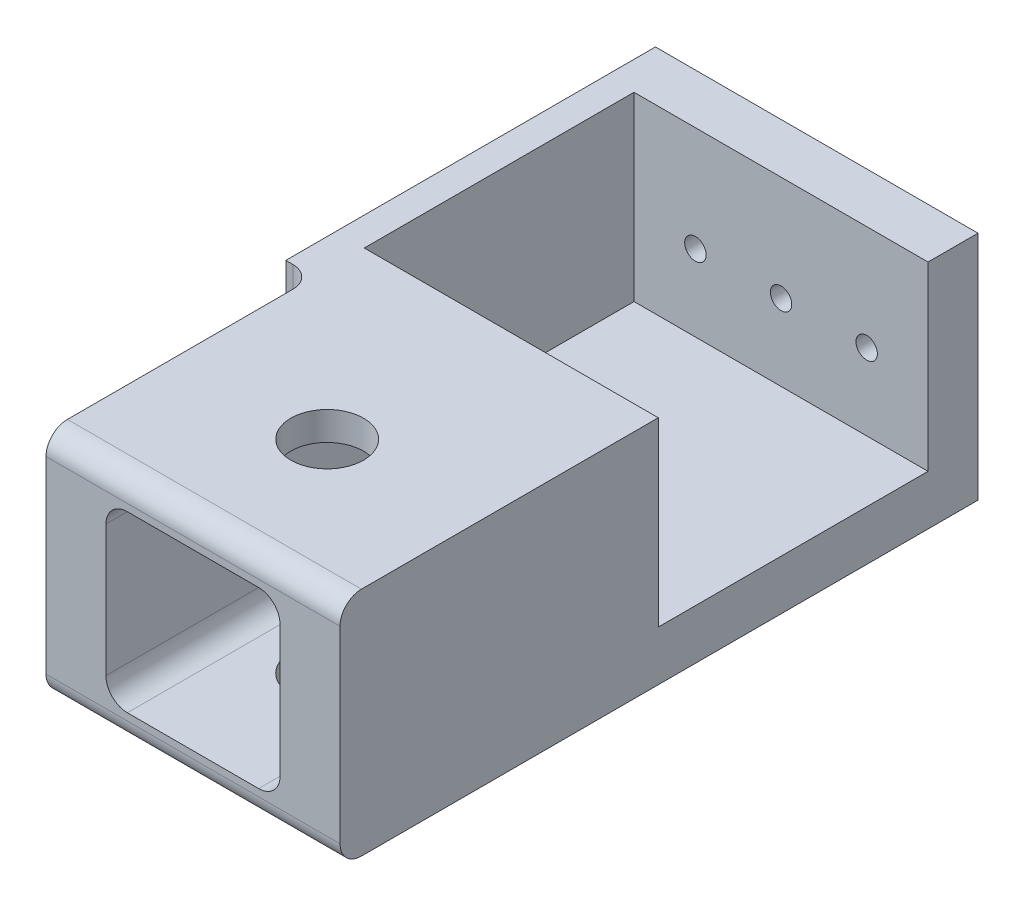
ISO-10303-21;
HEADER;
FILE_DESCRIPTION(('STEP AP214'),'2;1');
FILE_NAME('part.step','',(''),(''),'','','');
FILE_SCHEMA(('AUTOMOTIVE_DESIGN { 1 0 10303 214 1 1 1 1 }'));
ENDSEC;
DATA;
#1=APPLICATION_CONTEXT('core data for automotive mechanical design processes');
#2=APPLICATION_PROTOCOL_DEFINITION('international standard','automotive_design',2000,#1);
#3=PRODUCT_CONTEXT('',#1,'mechanical');
#4=PRODUCT('Part','Part','',(#3));
#5=PRODUCT_RELATED_PRODUCT_CATEGORY('part','',(#4));
#6=PRODUCT_DEFINITION_FORMATION('','',#4);
#7=PRODUCT_DEFINITION_CONTEXT('part definition',#1,'design');
#8=PRODUCT_DEFINITION('design','',#6,#7);
#9=PRODUCT_DEFINITION_SHAPE('','',#8);
#10=(LENGTH_UNIT() NAMED_UNIT(*) SI_UNIT(.MILLI.,.METRE.));
#11=(NAMED_UNIT(*) PLANE_ANGLE_UNIT() SI_UNIT($,.RADIAN.));
#12=(NAMED_UNIT(*) SI_UNIT($,.STERADIAN.) SOLID_ANGLE_UNIT());
#13=UNCERTAINTY_MEASURE_WITH_UNIT(LENGTH_MEASURE(1.E-05),#10,'distance_accuracy_value','');
#14=(GEOMETRIC_REPRESENTATION_CONTEXT(3) GLOBAL_UNCERTAINTY_ASSIGNED_CONTEXT((#13)) GLOBAL_UNIT_ASSIGNED_CONTEXT((#10,
#11,#12)) REPRESENTATION_CONTEXT('',''));
#15=CARTESIAN_POINT('',(0.,0.,0.));
#16=DIRECTION('',(0.,0.,1.));
#17=DIRECTION('',(1.,0.,0.));
#18=AXIS2_PLACEMENT_3D('',#15,#16,#17);
#19=CARTESIAN_POINT('',(-9.4,-3.5,12.95));
#20=DIRECTION('',(0.,0.,-1.));
#21=DIRECTION('',(-1.,0.,0.));
#22=AXIS2_PLACEMENT_3D('',#19,#20,#21);
#23=PLANE('',#22);
#24=DIRECTION('',(-1.,0.,0.));
#25=VECTOR('',#24,1.);
#26=CARTESIAN_POINT('',(-9.4,-3.5,12.95));
#27=LINE('',#26,#25);
#28=CARTESIAN_POINT('',(-12.7,-3.5,12.95));
#29=VERTEX_POINT('',#28);
#30=CARTESIAN_POINT('',(-13.2,-3.5,12.95));
#31=VERTEX_POINT('',#30);
#32=EDGE_CURVE('E208',#29,#31,#27,.T.);
#33=ORIENTED_EDGE('',*,*,#32,.F.);
#34=DIRECTION('',(0.,-1.,0.));
#35=VECTOR('',#34,1.);
#36=CARTESIAN_POINT('',(-12.7,12.7,12.95));
#37=LINE('',#36,#35);
#38=CARTESIAN_POINT('',(-12.7,12.7,12.95));
#39=VERTEX_POINT('',#38);
#40=EDGE_CURVE('E319',#29,#39,#37,.F.);
#41=ORIENTED_EDGE('',*,*,#40,.T.);
#42=DIRECTION('',(-1.,0.,0.));
#43=VECTOR('',#42,1.);
#44=CARTESIAN_POINT('',(0.,12.7,12.95));
#45=LINE('',#44,#43);
#46=CARTESIAN_POINT('',(-13.2,12.7,12.95));
#47=VERTEX_POINT('',#46);
#48=EDGE_CURVE('E250',#39,#47,#45,.T.);
#49=ORIENTED_EDGE('',*,*,#48,.T.);
#50=DIRECTION('',(0.,1.,0.));
#51=VECTOR('',#50,1.);
#52=CARTESIAN_POINT('',(-13.2,12.7,12.95));
#53=LINE('',#52,#51);
#54=EDGE_CURVE('E213',#31,#47,#53,.T.);
#55=ORIENTED_EDGE('',*,*,#54,.F.);
#56=EDGE_LOOP('',(#33,#41,#49,#55));
#57=FACE_BOUND('',#56,.T.);
#58=ADVANCED_FACE('F43',(#57),#23,.F.);
#59=CARTESIAN_POINT('',(0.,12.7,-9.45));
#60=DIRECTION('',(0.,0.,-1.));
#61=DIRECTION('',(-1.,0.,0.));
#62=AXIS2_PLACEMENT_3D('',#59,#60,#61);
#63=PLANE('',#62);
#64=CARTESIAN_POINT('',(5.1,5.34999999999996,-9.45));
#65=DIRECTION('',(0.,0.,-1.));
#66=DIRECTION('',(-1.,0.,0.));
#67=AXIS2_PLACEMENT_3D('',#64,#65,#66);
#68=CIRCLE('',#67,0.75);
#69=CARTESIAN_POINT('',(4.35,5.34999999999996,-9.45));
#70=VERTEX_POINT('',#69);
#71=EDGE_CURVE('E870',#70,#70,#68,.T.);
#72=ORIENTED_EDGE('',*,*,#71,.T.);
#73=EDGE_LOOP('',(#72));
#74=FACE_BOUND('',#73,.T.);
#75=CARTESIAN_POINT('',(-6.9,5.35,-9.45));
#76=DIRECTION('',(0.,0.,-1.));
#77=DIRECTION('',(-1.,0.,0.));
#78=AXIS2_PLACEMENT_3D('',#75,#76,#77);
#79=CIRCLE('',#78,0.75);
#80=CARTESIAN_POINT('',(-7.65,5.35,-9.45));
#81=VERTEX_POINT('',#80);
#82=EDGE_CURVE('E873',#81,#81,#79,.T.);
#83=ORIENTED_EDGE('',*,*,#82,.T.);
#84=EDGE_LOOP('',(#83));
#85=FACE_BOUND('',#84,.T.);
#86=CARTESIAN_POINT('',(-0.900000000000003,5.35,-9.45));
#87=DIRECTION('',(0.,0.,-1.));
#88=DIRECTION('',(-1.,0.,0.));
#89=AXIS2_PLACEMENT_3D('',#86,#87,#88);
#90=CIRCLE('',#89,0.75);
#91=CARTESIAN_POINT('',(-1.65,5.35,-9.45));
#92=VERTEX_POINT('',#91);
#93=EDGE_CURVE('E880',#92,#92,#90,.T.);
#94=ORIENTED_EDGE('',*,*,#93,.T.);
#95=EDGE_LOOP('',(#94));
#96=FACE_BOUND('',#95,.T.);
#97=DIRECTION('',(1.,0.,0.));
#98=VECTOR('',#97,1.);
#99=CARTESIAN_POINT('',(0.,0.,-9.45));
#100=LINE('',#99,#98);
#101=CARTESIAN_POINT('',(-11.2,0.,-9.45));
#102=VERTEX_POINT('',#101);
#103=CARTESIAN_POINT('',(9.4,0.,-9.45));
#104=VERTEX_POINT('',#103);
#105=EDGE_CURVE('E267',#102,#104,#100,.T.);
#106=ORIENTED_EDGE('',*,*,#105,.T.);
#107=DIRECTION('',(0.,-1.,0.));
#108=VECTOR('',#107,1.);
#109=CARTESIAN_POINT('',(9.4,12.7,-9.45));
#110=LINE('',#109,#108);
#111=CARTESIAN_POINT('',(9.4,12.7,-9.45));
#112=VERTEX_POINT('',#111);
#113=EDGE_CURVE('E285',#112,#104,#110,.T.);
#114=ORIENTED_EDGE('',*,*,#113,.F.);
#115=DIRECTION('',(1.,0.,0.));
#116=VECTOR('',#115,1.);
#117=CARTESIAN_POINT('',(0.,12.7,-9.45));
#118=LINE('',#117,#116);
#119=CARTESIAN_POINT('',(-11.2,12.7,-9.45));
#120=VERTEX_POINT('',#119);
#121=EDGE_CURVE('E271',#120,#112,#118,.T.);
#122=ORIENTED_EDGE('',*,*,#121,.F.);
#123=DIRECTION('',(0.,1.,0.));
#124=VECTOR('',#123,1.);
#125=CARTESIAN_POINT('',(-11.2,0.,-9.45));
#126=LINE('',#125,#124);
#127=EDGE_CURVE('E241',#102,#120,#126,.T.);
#128=ORIENTED_EDGE('',*,*,#127,.F.);
#129=EDGE_LOOP('',(#106,#114,#122,#128));
#130=FACE_BOUND('',#129,.T.);
#131=ADVANCED_FACE('F467',(#74,#85,#96,#130),#63,.F.);
#132=CARTESIAN_POINT('',(9.4,12.7,0.));
#133=DIRECTION('',(-1.,0.,0.));
#134=DIRECTION('',(0.,0.,1.));
#135=AXIS2_PLACEMENT_3D('',#132,#133,#134);
#136=PLANE('',#135);
#137=DIRECTION('',(0.,1.,0.));
#138=VECTOR('',#137,1.);
#139=CARTESIAN_POINT('',(9.4,12.7,31.75));
#140=LINE('',#139,#138);
#141=CARTESIAN_POINT('',(9.4,-2.,31.75));
#142=VERTEX_POINT('',#141);
#143=CARTESIAN_POINT('',(9.4,11.2,31.75));
#144=VERTEX_POINT('',#143);
#145=EDGE_CURVE('E428',#142,#144,#140,.T.);
#146=ORIENTED_EDGE('',*,*,#145,.F.);
#147=CARTESIAN_POINT('',(9.4,-2.,30.25));
#148=DIRECTION('',(-1.,0.,0.));
#149=DIRECTION('',(0.,0.,1.));
#150=AXIS2_PLACEMENT_3D('',#147,#148,#149);
#151=CIRCLE('',#150,1.5);
#152=CARTESIAN_POINT('',(9.4,-3.5,30.25));
#153=VERTEX_POINT('',#152);
#154=EDGE_CURVE('E300',#142,#153,#151,.F.);
#155=ORIENTED_EDGE('',*,*,#154,.T.);
#156=DIRECTION('',(0.,0.,1.));
#157=VECTOR('',#156,1.);
#158=CARTESIAN_POINT('',(9.4,-3.5,12.95));
#159=LINE('',#158,#157);
#160=CARTESIAN_POINT('',(9.4,-3.5,-12.95));
#161=VERTEX_POINT('',#160);
#162=EDGE_CURVE('E201',#161,#153,#159,.T.);
#163=ORIENTED_EDGE('',*,*,#162,.F.);
#164=DIRECTION('',(0.,-1.,0.));
#165=VECTOR('',#164,1.);
#166=CARTESIAN_POINT('',(9.4,12.7,-12.95));
#167=LINE('',#166,#165);
#168=CARTESIAN_POINT('',(9.4,12.7,-12.95));
#169=VERTEX_POINT('',#168);
#170=EDGE_CURVE('E196',#169,#161,#167,.T.);
#171=ORIENTED_EDGE('',*,*,#170,.F.);
#172=DIRECTION('',(0.,0.,-1.));
#173=VECTOR('',#172,1.);
#174=CARTESIAN_POINT('',(9.4,12.7,0.));
#175=LINE('',#174,#173);
#176=EDGE_CURVE('E274',#112,#169,#175,.T.);
#177=ORIENTED_EDGE('',*,*,#176,.F.);
#178=ORIENTED_EDGE('',*,*,#113,.T.);
#179=DIRECTION('',(0.,0.,1.));
#180=VECTOR('',#179,1.);
#181=CARTESIAN_POINT('',(9.4,0.,12.95));
#182=LINE('',#181,#180);
#183=CARTESIAN_POINT('',(9.4,0.,9.45));
#184=VERTEX_POINT('',#183);
#185=EDGE_CURVE('E202',#104,#184,#182,.T.);
#186=ORIENTED_EDGE('',*,*,#185,.T.);
#187=DIRECTION('',(0.,-1.,0.));
#188=VECTOR('',#187,1.);
#189=CARTESIAN_POINT('',(9.4,12.7,9.45));
#190=LINE('',#189,#188);
#191=CARTESIAN_POINT('',(9.4,12.7,9.45));
#192=VERTEX_POINT('',#191);
#193=EDGE_CURVE('E257',#192,#184,#190,.T.);
#194=ORIENTED_EDGE('',*,*,#193,.F.);
#195=DIRECTION('',(0.,0.,1.));
#196=VECTOR('',#195,1.);
#197=CARTESIAN_POINT('',(9.40000000000001,12.7,0.));
#198=LINE('',#197,#196);
#199=CARTESIAN_POINT('',(9.39999999999999,12.7,30.25));
#200=VERTEX_POINT('',#199);
#201=EDGE_CURVE('E253',#192,#200,#198,.T.);
#202=ORIENTED_EDGE('',*,*,#201,.T.);
#203=CARTESIAN_POINT('',(9.4,11.2,30.25));
#204=DIRECTION('',(-1.,0.,0.));
#205=DIRECTION('',(0.,0.,1.));
#206=AXIS2_PLACEMENT_3D('',#203,#204,#205);
#207=CIRCLE('',#206,1.5);
#208=EDGE_CURVE('E297',#200,#144,#207,.F.);
#209=ORIENTED_EDGE('',*,*,#208,.T.);
#210=EDGE_LOOP('',(#146,#155,#163,#171,#177,#178,#186,#194,#202,#209));
#211=FACE_BOUND('',#210,.T.);
#212=ADVANCED_FACE('F450',(#211),#136,.F.);
#213=CARTESIAN_POINT('',(0.,12.7,-12.95));
#214=DIRECTION('',(0.,0.,1.));
#215=DIRECTION('',(1.,0.,0.));
#216=AXIS2_PLACEMENT_3D('',#213,#214,#215);
#217=PLANE('',#216);
#218=CARTESIAN_POINT('',(5.1,5.34999999999996,-12.95));
#219=DIRECTION('',(0.,0.,-1.));
#220=DIRECTION('',(-1.,0.,0.));
#221=AXIS2_PLACEMENT_3D('',#218,#219,#220);
#222=CIRCLE('',#221,0.75);
#223=CARTESIAN_POINT('',(4.35,5.34999999999996,-12.95));
#224=VERTEX_POINT('',#223);
#225=EDGE_CURVE('E867',#224,#224,#222,.T.);
#226=ORIENTED_EDGE('',*,*,#225,.F.);
#227=EDGE_LOOP('',(#226));
#228=FACE_BOUND('',#227,.T.);
#229=CARTESIAN_POINT('',(-6.9,5.35,-12.95));
#230=DIRECTION('',(0.,0.,-1.));
#231=DIRECTION('',(-1.,0.,0.));
#232=AXIS2_PLACEMENT_3D('',#229,#230,#231);
#233=CIRCLE('',#232,0.75);
#234=CARTESIAN_POINT('',(-7.65,5.35,-12.95));
#235=VERTEX_POINT('',#234);
#236=EDGE_CURVE('E902',#235,#235,#233,.T.);
#237=ORIENTED_EDGE('',*,*,#236,.F.);
#238=EDGE_LOOP('',(#237));
#239=FACE_BOUND('',#238,.T.);
#240=CARTESIAN_POINT('',(-0.900000000000004,5.35,-12.95));
#241=DIRECTION('',(0.,0.,-1.));
#242=DIRECTION('',(-1.,0.,0.));
#243=AXIS2_PLACEMENT_3D('',#240,#241,#242);
#244=CIRCLE('',#243,0.75);
#245=CARTESIAN_POINT('',(-1.65,5.35,-12.95));
#246=VERTEX_POINT('',#245);
#247=EDGE_CURVE('E898',#246,#246,#244,.T.);
#248=ORIENTED_EDGE('',*,*,#247,.F.);
#249=EDGE_LOOP('',(#248));
#250=FACE_BOUND('',#249,.T.);
#251=ORIENTED_EDGE('',*,*,#170,.T.);
#252=DIRECTION('',(1.,0.,0.));
#253=VECTOR('',#252,1.);
#254=CARTESIAN_POINT('',(-9.4,-3.5,-12.95));
#255=LINE('',#254,#253);
#256=CARTESIAN_POINT('',(-13.2,-3.5,-12.95));
#257=VERTEX_POINT('',#256);
#258=EDGE_CURVE('E189',#257,#161,#255,.T.);
#259=ORIENTED_EDGE('',*,*,#258,.F.);
#260=DIRECTION('',(0.,-1.,0.));
#261=VECTOR('',#260,1.);
#262=CARTESIAN_POINT('',(-13.2,12.7,-12.95));
#263=LINE('',#262,#261);
#264=CARTESIAN_POINT('',(-13.2,12.7,-12.95));
#265=VERTEX_POINT('',#264);
#266=EDGE_CURVE('E194',#265,#257,#263,.T.);
#267=ORIENTED_EDGE('',*,*,#266,.F.);
#268=DIRECTION('',(-1.,0.,0.));
#269=VECTOR('',#268,1.);
#270=CARTESIAN_POINT('',(0.,12.7,-12.95));
#271=LINE('',#270,#269);
#272=EDGE_CURVE('E277',#169,#265,#271,.T.);
#273=ORIENTED_EDGE('',*,*,#272,.F.);
#274=EDGE_LOOP('',(#251,#259,#267,#273));
#275=FACE_BOUND('',#274,.T.);
#276=ADVANCED_FACE('F191',(#228,#239,#250,#275),#217,.F.);
#277=CARTESIAN_POINT('',(0.,12.7,0.));
#278=DIRECTION('',(0.,1.,0.));
#279=DIRECTION('',(0.,0.,1.));
#280=AXIS2_PLACEMENT_3D('',#277,#278,#279);
#281=PLANE('',#280);
#282=CARTESIAN_POINT('',(-0.899999999999998,12.7,22.35));
#283=DIRECTION('',(0.,1.,0.));
#284=DIRECTION('',(0.,0.,1.));
#285=AXIS2_PLACEMENT_3D('',#282,#283,#284);
#286=CIRCLE('',#285,2.55);
#287=CARTESIAN_POINT('',(-0.899999999999998,12.7,24.9));
#288=VERTEX_POINT('',#287);
#289=EDGE_CURVE('E391',#288,#288,#286,.T.);
#290=ORIENTED_EDGE('',*,*,#289,.F.);
#291=EDGE_LOOP('',(#290));
#292=FACE_BOUND('',#291,.T.);
#293=DIRECTION('',(0.,0.,-1.));
#294=VECTOR('',#293,1.);
#295=CARTESIAN_POINT('',(-11.2,12.7,31.75));
#296=LINE('',#295,#294);
#297=CARTESIAN_POINT('',(-11.2,12.7,30.25));
#298=VERTEX_POINT('',#297);
#299=CARTESIAN_POINT('',(-11.2,12.7,14.45));
#300=VERTEX_POINT('',#299);
#301=EDGE_CURVE('E431',#298,#300,#296,.T.);
#302=ORIENTED_EDGE('',*,*,#301,.F.);
#303=DIRECTION('',(-1.,0.,0.));
#304=VECTOR('',#303,1.);
#305=CARTESIAN_POINT('',(0.,12.7,30.25));
#306=LINE('',#305,#304);
#307=EDGE_CURVE('E316',#298,#200,#306,.F.);
#308=ORIENTED_EDGE('',*,*,#307,.T.);
#309=ORIENTED_EDGE('',*,*,#201,.F.);
#310=DIRECTION('',(1.,0.,0.));
#311=VECTOR('',#310,1.);
#312=CARTESIAN_POINT('',(0.,12.7,9.45));
#313=LINE('',#312,#311);
#314=CARTESIAN_POINT('',(-11.2,12.7,9.45));
#315=VERTEX_POINT('',#314);
#316=EDGE_CURVE('E246',#315,#192,#313,.T.);
#317=ORIENTED_EDGE('',*,*,#316,.F.);
#318=DIRECTION('',(0.,0.,-1.));
#319=VECTOR('',#318,1.);
#320=CARTESIAN_POINT('',(-11.2,12.7,-12.95));
#321=LINE('',#320,#319);
#322=EDGE_CURVE('E220',#315,#120,#321,.T.);
#323=ORIENTED_EDGE('',*,*,#322,.T.);
#324=ORIENTED_EDGE('',*,*,#121,.T.);
#325=ORIENTED_EDGE('',*,*,#176,.T.);
#326=ORIENTED_EDGE('',*,*,#272,.T.);
#327=DIRECTION('',(0.,0.,-1.));
#328=VECTOR('',#327,1.);
#329=CARTESIAN_POINT('',(-13.2,12.7,-12.95));
#330=LINE('',#329,#328);
#331=EDGE_CURVE('E218',#47,#265,#330,.T.);
#332=ORIENTED_EDGE('',*,*,#331,.F.);
#333=ORIENTED_EDGE('',*,*,#48,.F.);
#334=CARTESIAN_POINT('',(-12.7,12.7,14.45));
#335=DIRECTION('',(0.,1.,0.));
#336=DIRECTION('',(0.,0.,1.));
#337=AXIS2_PLACEMENT_3D('',#334,#335,#336);
#338=CIRCLE('',#337,1.5);
#339=EDGE_CURVE('E363',#39,#300,#338,.F.);
#340=ORIENTED_EDGE('',*,*,#339,.T.);
#341=EDGE_LOOP('',(#302,#308,#309,#317,#323,#324,#325,#326,#332,#333,#340));
#342=FACE_BOUND('',#341,.T.);
#343=ADVANCED_FACE('F457',(#292,#342),#281,.T.);
#344=CARTESIAN_POINT('',(0.,-3.5,0.));
#345=DIRECTION('',(0.,-1.,0.));
#346=DIRECTION('',(0.,0.,-1.));
#347=AXIS2_PLACEMENT_3D('',#344,#345,#346);
#348=PLANE('',#347);
#349=CARTESIAN_POINT('',(-0.899999999999998,-3.5,22.35));
#350=DIRECTION('',(0.,-1.,0.));
#351=DIRECTION('',(0.,0.,-1.));
#352=AXIS2_PLACEMENT_3D('',#349,#350,#351);
#353=CIRCLE('',#352,2.55);
#354=CARTESIAN_POINT('',(-0.899999999999998,-3.5,19.8));
#355=VERTEX_POINT('',#354);
#356=EDGE_CURVE('E872',#355,#355,#353,.T.);
#357=ORIENTED_EDGE('',*,*,#356,.F.);
#358=EDGE_LOOP('',(#357));
#359=FACE_BOUND('',#358,.T.);
#360=ORIENTED_EDGE('',*,*,#162,.T.);
#361=DIRECTION('',(1.,0.,0.));
#362=VECTOR('',#361,1.);
#363=CARTESIAN_POINT('',(0.,-3.5,30.25));
#364=LINE('',#363,#362);
#365=CARTESIAN_POINT('',(-11.2,-3.5,30.25));
#366=VERTEX_POINT('',#365);
#367=EDGE_CURVE('E303',#153,#366,#364,.F.);
#368=ORIENTED_EDGE('',*,*,#367,.T.);
#369=DIRECTION('',(0.,0.,-1.));
#370=VECTOR('',#369,1.);
#371=CARTESIAN_POINT('',(-11.2,-3.5,31.75));
#372=LINE('',#371,#370);
#373=CARTESIAN_POINT('',(-11.2,-3.5,14.45));
#374=VERTEX_POINT('',#373);
#375=EDGE_CURVE('E224',#366,#374,#372,.T.);
#376=ORIENTED_EDGE('',*,*,#375,.T.);
#377=CARTESIAN_POINT('',(-12.7,-3.5,14.45));
#378=DIRECTION('',(0.,-1.,0.));
#379=DIRECTION('',(0.,0.,-1.));
#380=AXIS2_PLACEMENT_3D('',#377,#378,#379);
#381=CIRCLE('',#380,1.5);
#382=EDGE_CURVE('E360',#374,#29,#381,.F.);
#383=ORIENTED_EDGE('',*,*,#382,.T.);
#384=ORIENTED_EDGE('',*,*,#32,.T.);
#385=DIRECTION('',(0.,0.,1.));
#386=VECTOR('',#385,1.);
#387=CARTESIAN_POINT('',(-13.2,-3.5,-12.95));
#388=LINE('',#387,#386);
#389=EDGE_CURVE('E205',#257,#31,#388,.T.);
#390=ORIENTED_EDGE('',*,*,#389,.F.);
#391=ORIENTED_EDGE('',*,*,#258,.T.);
#392=EDGE_LOOP('',(#360,#368,#376,#383,#384,#390,#391));
#393=FACE_BOUND('',#392,.T.);
#394=ADVANCED_FACE('F206',(#359,#393),#348,.T.);
#395=CARTESIAN_POINT('',(0.,0.,0.));
#396=DIRECTION('',(0.,-1.,0.));
#397=DIRECTION('',(0.,0.,-1.));
#398=AXIS2_PLACEMENT_3D('',#395,#396,#397);
#399=PLANE('',#398);
#400=ORIENTED_EDGE('',*,*,#105,.F.);
#401=DIRECTION('',(0.,0.,-1.));
#402=VECTOR('',#401,1.);
#403=CARTESIAN_POINT('',(-11.2,0.,9.45));
#404=LINE('',#403,#402);
#405=CARTESIAN_POINT('',(-11.2,0.,9.45));
#406=VERTEX_POINT('',#405);
#407=EDGE_CURVE('E237',#406,#102,#404,.T.);
#408=ORIENTED_EDGE('',*,*,#407,.F.);
#409=DIRECTION('',(1.,0.,0.));
#410=VECTOR('',#409,1.);
#411=CARTESIAN_POINT('',(0.,0.,9.45));
#412=LINE('',#411,#410);
#413=EDGE_CURVE('E245',#406,#184,#412,.T.);
#414=ORIENTED_EDGE('',*,*,#413,.T.);
#415=ORIENTED_EDGE('',*,*,#185,.F.);
#416=EDGE_LOOP('',(#400,#408,#414,#415));
#417=FACE_BOUND('',#416,.T.);
#418=ADVANCED_FACE('F471',(#417),#399,.F.);
#419=CARTESIAN_POINT('',(0.,12.7,9.45));
#420=DIRECTION('',(0.,0.,-1.));
#421=DIRECTION('',(-1.,0.,0.));
#422=AXIS2_PLACEMENT_3D('',#419,#420,#421);
#423=PLANE('',#422);
#424=ORIENTED_EDGE('',*,*,#413,.F.);
#425=DIRECTION('',(0.,-1.,0.));
#426=VECTOR('',#425,1.);
#427=CARTESIAN_POINT('',(-11.2,12.7,9.45));
#428=LINE('',#427,#426);
#429=EDGE_CURVE('E232',#315,#406,#428,.T.);
#430=ORIENTED_EDGE('',*,*,#429,.F.);
#431=ORIENTED_EDGE('',*,*,#316,.T.);
#432=ORIENTED_EDGE('',*,*,#193,.T.);
#433=EDGE_LOOP('',(#424,#430,#431,#432));
#434=FACE_BOUND('',#433,.T.);
#435=ADVANCED_FACE('F474',(#434),#423,.T.);
#436=CARTESIAN_POINT('',(-11.2,0.,0.));
#437=DIRECTION('',(-1.,0.,0.));
#438=DIRECTION('',(0.,0.,1.));
#439=AXIS2_PLACEMENT_3D('',#436,#437,#438);
#440=PLANE('',#439);
#441=ORIENTED_EDGE('',*,*,#322,.F.);
#442=ORIENTED_EDGE('',*,*,#429,.T.);
#443=ORIENTED_EDGE('',*,*,#407,.T.);
#444=ORIENTED_EDGE('',*,*,#127,.T.);
#445=EDGE_LOOP('',(#441,#442,#443,#444));
#446=FACE_BOUND('',#445,.T.);
#447=ADVANCED_FACE('F477',(#446),#440,.F.);
#448=CARTESIAN_POINT('',(-13.2,0.,0.));
#449=DIRECTION('',(-1.,0.,0.));
#450=DIRECTION('',(0.,0.,1.));
#451=AXIS2_PLACEMENT_3D('',#448,#449,#450);
#452=PLANE('',#451);
#453=ORIENTED_EDGE('',*,*,#266,.T.);
#454=ORIENTED_EDGE('',*,*,#389,.T.);
#455=ORIENTED_EDGE('',*,*,#54,.T.);
#456=ORIENTED_EDGE('',*,*,#331,.T.);
#457=EDGE_LOOP('',(#453,#454,#455,#456));
#458=FACE_BOUND('',#457,.T.);
#459=ADVANCED_FACE('F216',(#458),#452,.T.);
#460=CARTESIAN_POINT('',(-11.2,12.7,31.75));
#461=DIRECTION('',(1.,0.,0.));
#462=DIRECTION('',(0.,0.,-1.));
#463=AXIS2_PLACEMENT_3D('',#460,#461,#462);
#464=PLANE('',#463);
#465=ORIENTED_EDGE('',*,*,#375,.F.);
#466=CARTESIAN_POINT('',(-11.2,-2.,30.25));
#467=DIRECTION('',(1.,0.,0.));
#468=DIRECTION('',(0.,0.,-1.));
#469=AXIS2_PLACEMENT_3D('',#466,#467,#468);
#470=CIRCLE('',#469,1.5);
#471=CARTESIAN_POINT('',(-11.2,-2.,31.75));
#472=VERTEX_POINT('',#471);
#473=EDGE_CURVE('E313',#366,#472,#470,.F.);
#474=ORIENTED_EDGE('',*,*,#473,.T.);
#475=DIRECTION('',(0.,-1.,0.));
#476=VECTOR('',#475,1.);
#477=CARTESIAN_POINT('',(-11.2,12.7,31.75));
#478=LINE('',#477,#476);
#479=CARTESIAN_POINT('',(-11.2,11.2,31.75));
#480=VERTEX_POINT('',#479);
#481=EDGE_CURVE('E415',#480,#472,#478,.T.);
#482=ORIENTED_EDGE('',*,*,#481,.F.);
#483=CARTESIAN_POINT('',(-11.2,11.2,30.25));
#484=DIRECTION('',(1.,0.,0.));
#485=DIRECTION('',(0.,0.,-1.));
#486=AXIS2_PLACEMENT_3D('',#483,#484,#485);
#487=CIRCLE('',#486,1.5);
#488=EDGE_CURVE('E310',#480,#298,#487,.F.);
#489=ORIENTED_EDGE('',*,*,#488,.T.);
#490=ORIENTED_EDGE('',*,*,#301,.T.);
#491=DIRECTION('',(0.,-1.,0.));
#492=VECTOR('',#491,1.);
#493=CARTESIAN_POINT('',(-11.2,-3.5,14.45));
#494=LINE('',#493,#492);
#495=EDGE_CURVE('E306',#300,#374,#494,.T.);
#496=ORIENTED_EDGE('',*,*,#495,.T.);
#497=EDGE_LOOP('',(#465,#474,#482,#489,#490,#496));
#498=FACE_BOUND('',#497,.T.);
#499=ADVANCED_FACE('F442',(#498),#464,.F.);
#500=CARTESIAN_POINT('',(0.,0.,31.75));
#501=DIRECTION('',(0.,0.,1.));
#502=DIRECTION('',(1.,0.,0.));
#503=AXIS2_PLACEMENT_3D('',#500,#501,#502);
#504=PLANE('',#503);
#505=DIRECTION('',(0.,1.,0.));
#506=VECTOR('',#505,1.);
#507=CARTESIAN_POINT('',(5.2,10.7,31.75));
#508=LINE('',#507,#506);
#509=CARTESIAN_POINT('',(5.2,0.,31.75));
#510=VERTEX_POINT('',#509);
#511=CARTESIAN_POINT('',(5.2,9.2,31.75));
#512=VERTEX_POINT('',#511);
#513=EDGE_CURVE('E379',#510,#512,#508,.T.);
#514=ORIENTED_EDGE('',*,*,#513,.F.);
#515=CARTESIAN_POINT('',(3.7,0.,31.75));
#516=DIRECTION('',(0.,0.,1.));
#517=DIRECTION('',(1.,0.,0.));
#518=AXIS2_PLACEMENT_3D('',#515,#516,#517);
#519=CIRCLE('',#518,1.5);
#520=CARTESIAN_POINT('',(3.7,-1.5,31.75));
#521=VERTEX_POINT('',#520);
#522=EDGE_CURVE('E366',#510,#521,#519,.F.);
#523=ORIENTED_EDGE('',*,*,#522,.T.);
#524=DIRECTION('',(1.,0.,0.));
#525=VECTOR('',#524,1.);
#526=CARTESIAN_POINT('',(-7.,-1.5,31.75));
#527=LINE('',#526,#525);
#528=CARTESIAN_POINT('',(-5.5,-1.5,31.75));
#529=VERTEX_POINT('',#528);
#530=EDGE_CURVE('E410',#529,#521,#527,.T.);
#531=ORIENTED_EDGE('',*,*,#530,.F.);
#532=CARTESIAN_POINT('',(-5.5,0.,31.75));
#533=DIRECTION('',(0.,0.,1.));
#534=DIRECTION('',(1.,0.,0.));
#535=AXIS2_PLACEMENT_3D('',#532,#533,#534);
#536=CIRCLE('',#535,1.5);
#537=CARTESIAN_POINT('',(-7.,0.,31.75));
#538=VERTEX_POINT('',#537);
#539=EDGE_CURVE('E369',#529,#538,#536,.F.);
#540=ORIENTED_EDGE('',*,*,#539,.T.);
#541=DIRECTION('',(0.,-1.,0.));
#542=VECTOR('',#541,1.);
#543=CARTESIAN_POINT('',(-7.,10.7,31.75));
#544=LINE('',#543,#542);
#545=CARTESIAN_POINT('',(-7.,9.2,31.75));
#546=VERTEX_POINT('',#545);
#547=EDGE_CURVE('E419',#546,#538,#544,.T.);
#548=ORIENTED_EDGE('',*,*,#547,.F.);
#549=CARTESIAN_POINT('',(-5.5,9.2,31.75));
#550=DIRECTION('',(0.,0.,1.));
#551=DIRECTION('',(1.,0.,0.));
#552=AXIS2_PLACEMENT_3D('',#549,#550,#551);
#553=CIRCLE('',#552,1.5);
#554=CARTESIAN_POINT('',(-5.5,10.7,31.75));
#555=VERTEX_POINT('',#554);
#556=EDGE_CURVE('E11',#546,#555,#553,.F.);
#557=ORIENTED_EDGE('',*,*,#556,.T.);
#558=DIRECTION('',(-1.,0.,0.));
#559=VECTOR('',#558,1.);
#560=CARTESIAN_POINT('',(-7.,10.7,31.75));
#561=LINE('',#560,#559);
#562=CARTESIAN_POINT('',(3.7,10.7,31.75));
#563=VERTEX_POINT('',#562);
#564=EDGE_CURVE('E381',#563,#555,#561,.T.);
#565=ORIENTED_EDGE('',*,*,#564,.F.);
#566=CARTESIAN_POINT('',(3.7,9.2,31.75));
#567=DIRECTION('',(0.,0.,1.));
#568=DIRECTION('',(1.,0.,0.));
#569=AXIS2_PLACEMENT_3D('',#566,#567,#568);
#570=CIRCLE('',#569,1.5);
#571=EDGE_CURVE('E53',#563,#512,#570,.F.);
#572=ORIENTED_EDGE('',*,*,#571,.T.);
#573=EDGE_LOOP('',(#514,#523,#531,#540,#548,#557,#565,#572));
#574=FACE_BOUND('',#573,.T.);
#575=ORIENTED_EDGE('',*,*,#481,.T.);
#576=DIRECTION('',(1.,0.,0.));
#577=VECTOR('',#576,1.);
#578=CARTESIAN_POINT('',(0.,-2.,31.75));
#579=LINE('',#578,#577);
#580=EDGE_CURVE('E293',#472,#142,#579,.T.);
#581=ORIENTED_EDGE('',*,*,#580,.T.);
#582=ORIENTED_EDGE('',*,*,#145,.T.);
#583=DIRECTION('',(-1.,0.,0.));
#584=VECTOR('',#583,1.);
#585=CARTESIAN_POINT('',(0.,11.2,31.75));
#586=LINE('',#585,#584);
#587=EDGE_CURVE('E289',#144,#480,#586,.T.);
#588=ORIENTED_EDGE('',*,*,#587,.T.);
#589=EDGE_LOOP('',(#575,#581,#582,#588));
#590=FACE_BOUND('',#589,.T.);
#591=ADVANCED_FACE('F377',(#574,#590),#504,.T.);
#592=CARTESIAN_POINT('',(5.2,10.7,12.95));
#593=DIRECTION('',(1.,0.,0.));
#594=DIRECTION('',(0.,1.,0.));
#595=AXIS2_PLACEMENT_3D('',#592,#593,#594);
#596=PLANE('',#595);
#597=DIRECTION('',(0.,1.,0.));
#598=VECTOR('',#597,1.);
#599=CARTESIAN_POINT('',(5.2,10.7,12.95));
#600=LINE('',#599,#598);
#601=CARTESIAN_POINT('',(5.2,0.,12.95));
#602=VERTEX_POINT('',#601);
#603=CARTESIAN_POINT('',(5.2,9.2,12.95));
#604=VERTEX_POINT('',#603);
#605=EDGE_CURVE('E399',#602,#604,#600,.T.);
#606=ORIENTED_EDGE('',*,*,#605,.F.);
#607=DIRECTION('',(0.,0.,1.));
#608=VECTOR('',#607,1.);
#609=CARTESIAN_POINT('',(5.2,0.,31.75));
#610=LINE('',#609,#608);
#611=EDGE_CURVE('E325',#602,#510,#610,.T.);
#612=ORIENTED_EDGE('',*,*,#611,.T.);
#613=ORIENTED_EDGE('',*,*,#513,.T.);
#614=DIRECTION('',(0.,0.,1.));
#615=VECTOR('',#614,1.);
#616=CARTESIAN_POINT('',(5.2,9.2,12.95));
#617=LINE('',#616,#615);
#618=EDGE_CURVE('E322',#512,#604,#617,.F.);
#619=ORIENTED_EDGE('',*,*,#618,.T.);
#620=EDGE_LOOP('',(#606,#612,#613,#619));
#621=FACE_BOUND('',#620,.T.);
#622=ADVANCED_FACE('F387',(#621),#596,.F.);
#623=CARTESIAN_POINT('',(-7.,-1.5,12.95));
#624=DIRECTION('',(0.,-1.,0.));
#625=DIRECTION('',(0.,0.,-1.));
#626=AXIS2_PLACEMENT_3D('',#623,#624,#625);
#627=PLANE('',#626);
#628=CARTESIAN_POINT('',(-0.899999999999998,-1.5,22.35));
#629=DIRECTION('',(0.,-1.,0.));
#630=DIRECTION('',(0.,0.,-1.));
#631=AXIS2_PLACEMENT_3D('',#628,#629,#630);
#632=CIRCLE('',#631,2.55);
#633=CARTESIAN_POINT('',(-0.899999999999998,-1.5,19.8));
#634=VERTEX_POINT('',#633);
#635=EDGE_CURVE('E884',#634,#634,#632,.T.);
#636=ORIENTED_EDGE('',*,*,#635,.T.);
#637=EDGE_LOOP('',(#636));
#638=FACE_BOUND('',#637,.T.);
#639=ORIENTED_EDGE('',*,*,#530,.T.);
#640=DIRECTION('',(0.,0.,1.));
#641=VECTOR('',#640,1.);
#642=CARTESIAN_POINT('',(3.7,-1.5,12.95));
#643=LINE('',#642,#641);
#644=CARTESIAN_POINT('',(3.7,-1.5,12.95));
#645=VERTEX_POINT('',#644);
#646=EDGE_CURVE('E333',#521,#645,#643,.F.);
#647=ORIENTED_EDGE('',*,*,#646,.T.);
#648=DIRECTION('',(1.,0.,0.));
#649=VECTOR('',#648,1.);
#650=CARTESIAN_POINT('',(-7.,-1.5,12.95));
#651=LINE('',#650,#649);
#652=CARTESIAN_POINT('',(-5.5,-1.5,12.95));
#653=VERTEX_POINT('',#652);
#654=EDGE_CURVE('E408',#653,#645,#651,.T.);
#655=ORIENTED_EDGE('',*,*,#654,.F.);
#656=DIRECTION('',(0.,0.,1.));
#657=VECTOR('',#656,1.);
#658=CARTESIAN_POINT('',(-5.5,-1.5,31.75));
#659=LINE('',#658,#657);
#660=EDGE_CURVE('E329',#653,#529,#659,.T.);
#661=ORIENTED_EDGE('',*,*,#660,.T.);
#662=EDGE_LOOP('',(#639,#647,#655,#661));
#663=FACE_BOUND('',#662,.T.);
#664=ADVANCED_FACE('F537',(#638,#663),#627,.F.);
#665=CARTESIAN_POINT('',(-7.,10.7,12.95));
#666=DIRECTION('',(-1.,0.,0.));
#667=DIRECTION('',(0.,-1.,0.));
#668=AXIS2_PLACEMENT_3D('',#665,#666,#667);
#669=PLANE('',#668);
#670=ORIENTED_EDGE('',*,*,#547,.T.);
#671=DIRECTION('',(0.,0.,1.));
#672=VECTOR('',#671,1.);
#673=CARTESIAN_POINT('',(-7.,0.,12.95));
#674=LINE('',#673,#672);
#675=CARTESIAN_POINT('',(-7.,0.,12.95));
#676=VERTEX_POINT('',#675);
#677=EDGE_CURVE('E60',#538,#676,#674,.F.);
#678=ORIENTED_EDGE('',*,*,#677,.T.);
#679=DIRECTION('',(0.,-1.,0.));
#680=VECTOR('',#679,1.);
#681=CARTESIAN_POINT('',(-7.,10.7,12.95));
#682=LINE('',#681,#680);
#683=CARTESIAN_POINT('',(-7.,9.2,12.95));
#684=VERTEX_POINT('',#683);
#685=EDGE_CURVE('E404',#684,#676,#682,.T.);
#686=ORIENTED_EDGE('',*,*,#685,.F.);
#687=DIRECTION('',(0.,0.,1.));
#688=VECTOR('',#687,1.);
#689=CARTESIAN_POINT('',(-7.,9.2,31.75));
#690=LINE('',#689,#688);
#691=EDGE_CURVE('E347',#684,#546,#690,.T.);
#692=ORIENTED_EDGE('',*,*,#691,.T.);
#693=EDGE_LOOP('',(#670,#678,#686,#692));
#694=FACE_BOUND('',#693,.T.);
#695=ADVANCED_FACE('F531',(#694),#669,.F.);
#696=CARTESIAN_POINT('',(-7.,10.7,12.95));
#697=DIRECTION('',(0.,1.,0.));
#698=DIRECTION('',(0.,0.,1.));
#699=AXIS2_PLACEMENT_3D('',#696,#697,#698);
#700=PLANE('',#699);
#701=CARTESIAN_POINT('',(-0.899999999999998,10.7,22.35));
#702=DIRECTION('',(0.,1.,0.));
#703=DIRECTION('',(0.,0.,1.));
#704=AXIS2_PLACEMENT_3D('',#701,#702,#703);
#705=CIRCLE('',#704,2.55);
#706=CARTESIAN_POINT('',(-0.899999999999998,10.7,24.9));
#707=VERTEX_POINT('',#706);
#708=EDGE_CURVE('E47',#707,#707,#705,.T.);
#709=ORIENTED_EDGE('',*,*,#708,.T.);
#710=EDGE_LOOP('',(#709));
#711=FACE_BOUND('',#710,.T.);
#712=DIRECTION('',(-1.,0.,0.));
#713=VECTOR('',#712,1.);
#714=CARTESIAN_POINT('',(-7.,10.7,12.95));
#715=LINE('',#714,#713);
#716=CARTESIAN_POINT('',(3.7,10.7,12.95));
#717=VERTEX_POINT('',#716);
#718=CARTESIAN_POINT('',(-5.5,10.7,12.95));
#719=VERTEX_POINT('',#718);
#720=EDGE_CURVE('E398',#717,#719,#715,.T.);
#721=ORIENTED_EDGE('',*,*,#720,.F.);
#722=DIRECTION('',(0.,0.,1.));
#723=VECTOR('',#722,1.);
#724=CARTESIAN_POINT('',(3.7,10.7,31.75));
#725=LINE('',#724,#723);
#726=EDGE_CURVE('E356',#717,#563,#725,.T.);
#727=ORIENTED_EDGE('',*,*,#726,.T.);
#728=ORIENTED_EDGE('',*,*,#564,.T.);
#729=DIRECTION('',(0.,0.,1.));
#730=VECTOR('',#729,1.);
#731=CARTESIAN_POINT('',(-5.5,10.7,12.95));
#732=LINE('',#731,#730);
#733=EDGE_CURVE('E353',#555,#719,#732,.F.);
#734=ORIENTED_EDGE('',*,*,#733,.T.);
#735=EDGE_LOOP('',(#721,#727,#728,#734));
#736=FACE_BOUND('',#735,.T.);
#737=ADVANCED_FACE('F401',(#711,#736),#700,.F.);
#738=CARTESIAN_POINT('',(0.,0.,12.95));
#739=DIRECTION('',(0.,0.,1.));
#740=DIRECTION('',(1.,0.,0.));
#741=AXIS2_PLACEMENT_3D('',#738,#739,#740);
#742=PLANE('',#741);
#743=ORIENTED_EDGE('',*,*,#654,.T.);
#744=CARTESIAN_POINT('',(3.7,0.,12.95));
#745=DIRECTION('',(0.,0.,1.));
#746=DIRECTION('',(1.,0.,0.));
#747=AXIS2_PLACEMENT_3D('',#744,#745,#746);
#748=CIRCLE('',#747,1.5);
#749=EDGE_CURVE('E344',#645,#602,#748,.T.);
#750=ORIENTED_EDGE('',*,*,#749,.T.);
#751=ORIENTED_EDGE('',*,*,#605,.T.);
#752=CARTESIAN_POINT('',(3.7,9.2,12.95));
#753=DIRECTION('',(0.,0.,1.));
#754=DIRECTION('',(1.,0.,0.));
#755=AXIS2_PLACEMENT_3D('',#752,#753,#754);
#756=CIRCLE('',#755,1.5);
#757=EDGE_CURVE('E338',#604,#717,#756,.T.);
#758=ORIENTED_EDGE('',*,*,#757,.T.);
#759=ORIENTED_EDGE('',*,*,#720,.T.);
#760=CARTESIAN_POINT('',(-5.5,9.2,12.95));
#761=DIRECTION('',(0.,0.,1.));
#762=DIRECTION('',(1.,0.,0.));
#763=AXIS2_PLACEMENT_3D('',#760,#761,#762);
#764=CIRCLE('',#763,1.5);
#765=EDGE_CURVE('E67',#719,#684,#764,.T.);
#766=ORIENTED_EDGE('',*,*,#765,.T.);
#767=ORIENTED_EDGE('',*,*,#685,.T.);
#768=CARTESIAN_POINT('',(-5.5,0.,12.95));
#769=DIRECTION('',(0.,0.,1.));
#770=DIRECTION('',(1.,0.,0.));
#771=AXIS2_PLACEMENT_3D('',#768,#769,#770);
#772=CIRCLE('',#771,1.5);
#773=EDGE_CURVE('E341',#676,#653,#772,.T.);
#774=ORIENTED_EDGE('',*,*,#773,.T.);
#775=EDGE_LOOP('',(#743,#750,#751,#758,#759,#766,#767,#774));
#776=FACE_BOUND('',#775,.T.);
#777=ADVANCED_FACE('F397',(#776),#742,.T.);
#778=CARTESIAN_POINT('',(0.,-2.,30.25));
#779=DIRECTION('',(1.,0.,0.));
#780=DIRECTION('',(0.,0.,-1.));
#781=AXIS2_PLACEMENT_3D('',#778,#779,#780);
#782=CYLINDRICAL_SURFACE('',#781,1.5);
#783=ORIENTED_EDGE('',*,*,#473,.F.);
#784=ORIENTED_EDGE('',*,*,#367,.F.);
#785=ORIENTED_EDGE('',*,*,#154,.F.);
#786=ORIENTED_EDGE('',*,*,#580,.F.);
#787=EDGE_LOOP('',(#783,#784,#785,#786));
#788=FACE_BOUND('',#787,.T.);
#789=ADVANCED_FACE('F446',(#788),#782,.T.);
#790=CARTESIAN_POINT('',(0.,11.2,30.25));
#791=DIRECTION('',(-1.,0.,0.));
#792=DIRECTION('',(0.,0.,1.));
#793=AXIS2_PLACEMENT_3D('',#790,#791,#792);
#794=CYLINDRICAL_SURFACE('',#793,1.5);
#795=ORIENTED_EDGE('',*,*,#208,.F.);
#796=ORIENTED_EDGE('',*,*,#307,.F.);
#797=ORIENTED_EDGE('',*,*,#488,.F.);
#798=ORIENTED_EDGE('',*,*,#587,.F.);
#799=EDGE_LOOP('',(#795,#796,#797,#798));
#800=FACE_BOUND('',#799,.T.);
#801=ADVANCED_FACE('F455',(#800),#794,.T.);
#802=CARTESIAN_POINT('',(-12.7,12.7,14.45));
#803=DIRECTION('',(0.,1.,0.));
#804=DIRECTION('',(0.,0.,1.));
#805=AXIS2_PLACEMENT_3D('',#802,#803,#804);
#806=CYLINDRICAL_SURFACE('',#805,1.5);
#807=ORIENTED_EDGE('',*,*,#339,.F.);
#808=ORIENTED_EDGE('',*,*,#40,.F.);
#809=ORIENTED_EDGE('',*,*,#382,.F.);
#810=ORIENTED_EDGE('',*,*,#495,.F.);
#811=EDGE_LOOP('',(#807,#808,#809,#810));
#812=FACE_BOUND('',#811,.T.);
#813=ADVANCED_FACE('F462',(#812),#806,.F.);
#814=CARTESIAN_POINT('',(3.7,0.,12.95));
#815=DIRECTION('',(0.,0.,-1.));
#816=DIRECTION('',(-1.,0.,0.));
#817=AXIS2_PLACEMENT_3D('',#814,#815,#816);
#818=CYLINDRICAL_SURFACE('',#817,1.5);
#819=ORIENTED_EDGE('',*,*,#749,.F.);
#820=ORIENTED_EDGE('',*,*,#646,.F.);
#821=ORIENTED_EDGE('',*,*,#522,.F.);
#822=ORIENTED_EDGE('',*,*,#611,.F.);
#823=EDGE_LOOP('',(#819,#820,#821,#822));
#824=FACE_BOUND('',#823,.T.);
#825=ADVANCED_FACE('F510',(#824),#818,.F.);
#826=CARTESIAN_POINT('',(-5.5,0.,12.95));
#827=DIRECTION('',(0.,0.,-1.));
#828=DIRECTION('',(-1.,0.,0.));
#829=AXIS2_PLACEMENT_3D('',#826,#827,#828);
#830=CYLINDRICAL_SURFACE('',#829,1.5);
#831=ORIENTED_EDGE('',*,*,#773,.F.);
#832=ORIENTED_EDGE('',*,*,#677,.F.);
#833=ORIENTED_EDGE('',*,*,#539,.F.);
#834=ORIENTED_EDGE('',*,*,#660,.F.);
#835=EDGE_LOOP('',(#831,#832,#833,#834));
#836=FACE_BOUND('',#835,.T.);
#837=ADVANCED_FACE('F513',(#836),#830,.F.);
#838=CARTESIAN_POINT('',(3.7,9.2,12.95));
#839=DIRECTION('',(0.,0.,-1.));
#840=DIRECTION('',(-1.,0.,0.));
#841=AXIS2_PLACEMENT_3D('',#838,#839,#840);
#842=CYLINDRICAL_SURFACE('',#841,1.5);
#843=ORIENTED_EDGE('',*,*,#757,.F.);
#844=ORIENTED_EDGE('',*,*,#618,.F.);
#845=ORIENTED_EDGE('',*,*,#571,.F.);
#846=ORIENTED_EDGE('',*,*,#726,.F.);
#847=EDGE_LOOP('',(#843,#844,#845,#846));
#848=FACE_BOUND('',#847,.T.);
#849=ADVANCED_FACE('F394',(#848),#842,.F.);
#850=CARTESIAN_POINT('',(-5.5,9.2,12.95));
#851=DIRECTION('',(0.,0.,-1.));
#852=DIRECTION('',(-1.,0.,0.));
#853=AXIS2_PLACEMENT_3D('',#850,#851,#852);
#854=CYLINDRICAL_SURFACE('',#853,1.5);
#855=ORIENTED_EDGE('',*,*,#765,.F.);
#856=ORIENTED_EDGE('',*,*,#733,.F.);
#857=ORIENTED_EDGE('',*,*,#556,.F.);
#858=ORIENTED_EDGE('',*,*,#691,.F.);
#859=EDGE_LOOP('',(#855,#856,#857,#858));
#860=FACE_BOUND('',#859,.T.);
#861=ADVANCED_FACE('F45',(#860),#854,.F.);
#862=CARTESIAN_POINT('',(-0.899999999999998,15.3,22.35));
#863=DIRECTION('',(0.,-1.,0.));
#864=DIRECTION('',(0.,0.,-1.));
#865=AXIS2_PLACEMENT_3D('',#862,#863,#864);
#866=CYLINDRICAL_SURFACE('',#865,2.55);
#867=ORIENTED_EDGE('',*,*,#289,.T.);
#868=EDGE_LOOP('',(#867));
#869=FACE_BOUND('',#868,.T.);
#870=ORIENTED_EDGE('',*,*,#708,.F.);
#871=EDGE_LOOP('',(#870));
#872=FACE_BOUND('',#871,.T.);
#873=ADVANCED_FACE('F521',(#869,#872),#866,.F.);
#874=ORIENTED_EDGE('',*,*,#356,.T.);
#875=EDGE_LOOP('',(#874));
#876=FACE_BOUND('',#875,.T.);
#877=ORIENTED_EDGE('',*,*,#635,.F.);
#878=EDGE_LOOP('',(#877));
#879=FACE_BOUND('',#878,.T.);
#880=ADVANCED_FACE('F526',(#876,#879),#866,.F.);
#881=CARTESIAN_POINT('',(-0.900000000000003,5.35,-5.95));
#882=DIRECTION('',(0.,0.,-1.));
#883=DIRECTION('',(-1.,0.,0.));
#884=AXIS2_PLACEMENT_3D('',#881,#882,#883);
#885=CYLINDRICAL_SURFACE('',#884,0.75);
#886=ORIENTED_EDGE('',*,*,#247,.T.);
#887=EDGE_LOOP('',(#886));
#888=FACE_BOUND('',#887,.T.);
#889=ORIENTED_EDGE('',*,*,#93,.F.);
#890=EDGE_LOOP('',(#889));
#891=FACE_BOUND('',#890,.T.);
#892=ADVANCED_FACE('F678',(#888,#891),#885,.F.);
#893=CARTESIAN_POINT('',(-6.9,5.35,-5.95));
#894=DIRECTION('',(0.,0.,-1.));
#895=DIRECTION('',(-1.,0.,0.));
#896=AXIS2_PLACEMENT_3D('',#893,#894,#895);
#897=CYLINDRICAL_SURFACE('',#896,0.75);
#898=ORIENTED_EDGE('',*,*,#236,.T.);
#899=EDGE_LOOP('',(#898));
#900=FACE_BOUND('',#899,.T.);
#901=ORIENTED_EDGE('',*,*,#82,.F.);
#902=EDGE_LOOP('',(#901));
#903=FACE_BOUND('',#902,.T.);
#904=ADVANCED_FACE('F704',(#900,#903),#897,.F.);
#905=CARTESIAN_POINT('',(5.1,5.34999999999996,-5.95));
#906=DIRECTION('',(0.,0.,-1.));
#907=DIRECTION('',(-1.,0.,0.));
#908=AXIS2_PLACEMENT_3D('',#905,#906,#907);
#909=CYLINDRICAL_SURFACE('',#908,0.75);
#910=ORIENTED_EDGE('',*,*,#225,.T.);
#911=EDGE_LOOP('',(#910));
#912=FACE_BOUND('',#911,.T.);
#913=ORIENTED_EDGE('',*,*,#71,.F.);
#914=EDGE_LOOP('',(#913));
#915=FACE_BOUND('',#914,.T.);
#916=ADVANCED_FACE('F715',(#912,#915),#909,.F.);
#917=CLOSED_SHELL('',(#58,#131,#212,#276,#343,#394,#418,#435,#447,#459,#499,#591,#622,#664,#695,
#737,#777,#789,#801,#813,#825,#837,#849,#861,#873,#880,#892,#904,#916));
#918=MANIFOLD_SOLID_BREP('B2',#917);
#919=ADVANCED_BREP_SHAPE_REPRESENTATION('',(#18,#918),#14);
#920=SHAPE_DEFINITION_REPRESENTATION(#9,#919);
ENDSEC;
END-ISO-10303-21;
